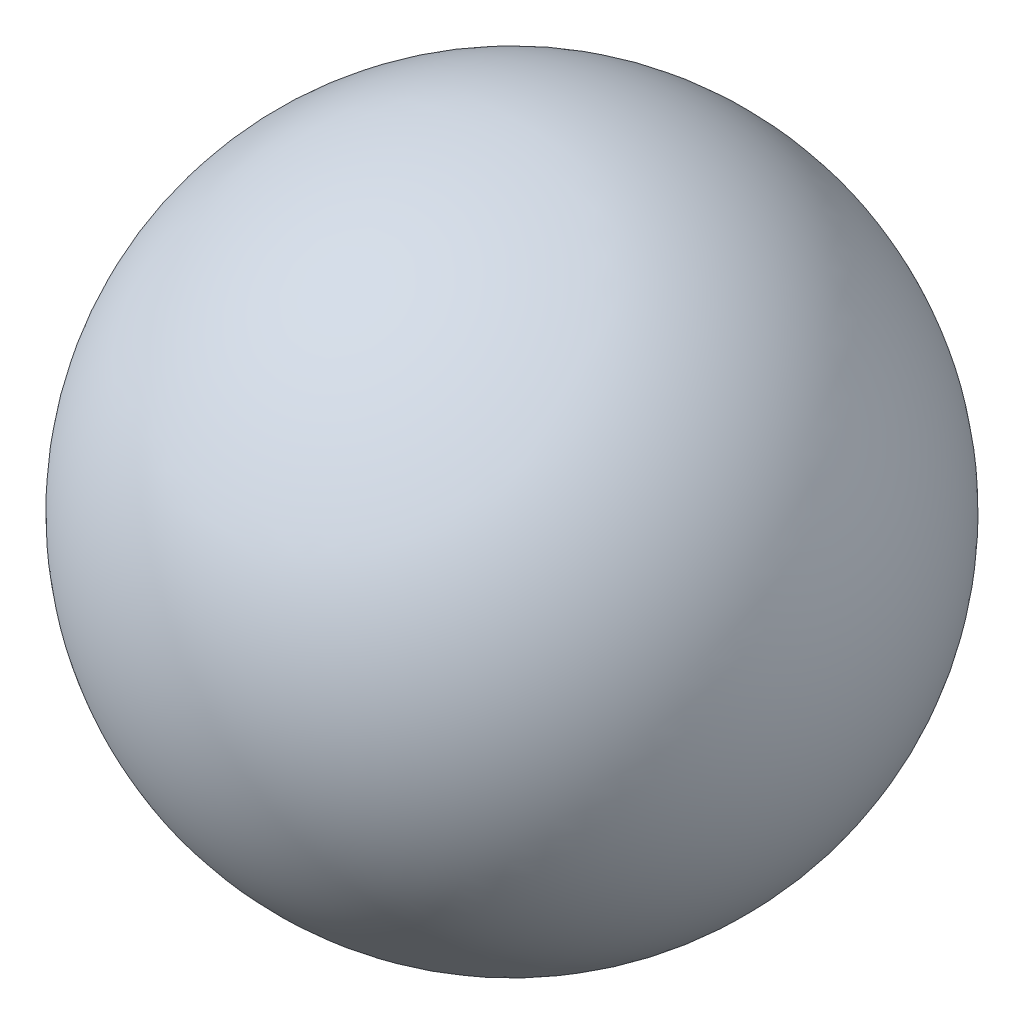
ISO-10303-21;
HEADER;
FILE_DESCRIPTION(('STEP AP214'),'2;1');
FILE_NAME('part.step','',(''),(''),'','','');
FILE_SCHEMA(('AUTOMOTIVE_DESIGN { 1 0 10303 214 1 1 1 1 }'));
ENDSEC;
DATA;
#1=APPLICATION_CONTEXT('core data for automotive mechanical design processes');
#2=APPLICATION_PROTOCOL_DEFINITION('international standard','automotive_design',2000,#1);
#3=PRODUCT_CONTEXT('',#1,'mechanical');
#4=PRODUCT('Part','Part','',(#3));
#5=PRODUCT_RELATED_PRODUCT_CATEGORY('part','',(#4));
#6=PRODUCT_DEFINITION_FORMATION('','',#4);
#7=PRODUCT_DEFINITION_CONTEXT('part definition',#1,'design');
#8=PRODUCT_DEFINITION('design','',#6,#7);
#9=PRODUCT_DEFINITION_SHAPE('','',#8);
#10=(LENGTH_UNIT() NAMED_UNIT(*) SI_UNIT(.MILLI.,.METRE.));
#11=(NAMED_UNIT(*) PLANE_ANGLE_UNIT() SI_UNIT($,.RADIAN.));
#12=(NAMED_UNIT(*) SI_UNIT($,.STERADIAN.) SOLID_ANGLE_UNIT());
#13=UNCERTAINTY_MEASURE_WITH_UNIT(LENGTH_MEASURE(1.E-05),#10,'distance_accuracy_value','');
#14=(GEOMETRIC_REPRESENTATION_CONTEXT(3) GLOBAL_UNCERTAINTY_ASSIGNED_CONTEXT((#13)) GLOBAL_UNIT_ASSIGNED_CONTEXT((#10,
#11,#12)) REPRESENTATION_CONTEXT('',''));
#15=CARTESIAN_POINT('',(0.,0.,0.));
#16=DIRECTION('',(0.,0.,1.));
#17=DIRECTION('',(1.,0.,0.));
#18=AXIS2_PLACEMENT_3D('',#15,#16,#17);
#19=CARTESIAN_POINT('',(0.,0.,0.));
#20=DIRECTION('',(0.,0.,-1.));
#21=DIRECTION('',(1.,0.,0.));
#22=AXIS2_PLACEMENT_3D('',#19,#20,#21);
#23=SPHERICAL_SURFACE('',#22,2.25);
#24=CARTESIAN_POINT('',(0.,0.,-2.25));
#25=VERTEX_POINT('',#24);
#26=VERTEX_LOOP('',#25);
#27=FACE_BOUND('',#26,.T.);
#28=ADVANCED_FACE('F40',(#27),#23,.T.);
#29=CLOSED_SHELL('',(#28));
#30=CARTESIAN_POINT('',(0.,0.,0.));
#31=DIRECTION('',(0.,0.,-1.));
#32=DIRECTION('',(1.,0.,0.));
#33=AXIS2_PLACEMENT_3D('',#30,#31,#32);
#34=SPHERICAL_SURFACE('',#33,2.2);
#35=CARTESIAN_POINT('',(0.,0.,-2.2));
#36=VERTEX_POINT('',#35);
#37=VERTEX_LOOP('',#36);
#38=FACE_BOUND('',#37,.T.);
#39=ADVANCED_FACE('F54',(#38),#34,.F.);
#40=CLOSED_SHELL('',(#39));
#41=ORIENTED_CLOSED_SHELL('',*,#40,.T.);
#42=BREP_WITH_VOIDS('B2',#29,(#41));
#43=ADVANCED_BREP_SHAPE_REPRESENTATION('',(#18,#42),#14);
#44=SHAPE_DEFINITION_REPRESENTATION(#9,#43);
ENDSEC;
END-ISO-10303-21;
